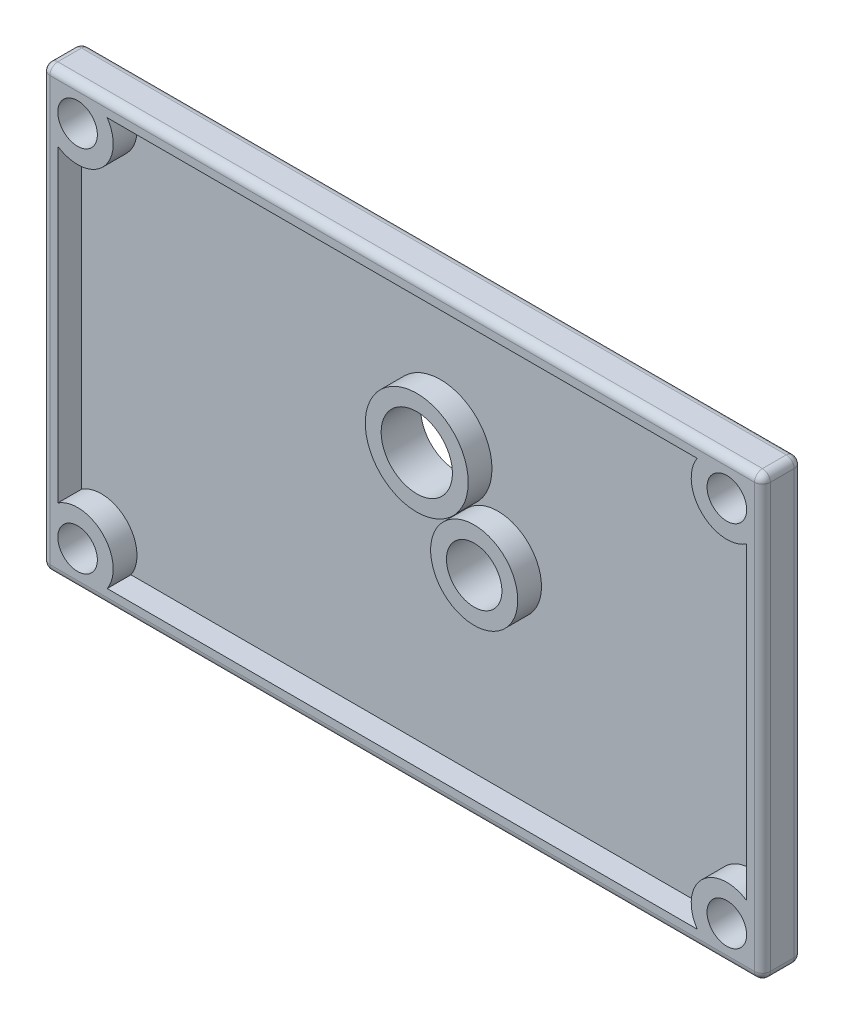
ISO-10303-21;
HEADER;
FILE_DESCRIPTION(('STEP AP214'),'2;1');
FILE_NAME('part.step','',(''),(''),'','','');
FILE_SCHEMA(('AUTOMOTIVE_DESIGN { 1 0 10303 214 1 1 1 1 }'));
ENDSEC;
DATA;
#1=APPLICATION_CONTEXT('core data for automotive mechanical design processes');
#2=APPLICATION_PROTOCOL_DEFINITION('international standard','automotive_design',2000,#1);
#3=PRODUCT_CONTEXT('',#1,'mechanical');
#4=PRODUCT('Part','Part','',(#3));
#5=PRODUCT_RELATED_PRODUCT_CATEGORY('part','',(#4));
#6=PRODUCT_DEFINITION_FORMATION('','',#4);
#7=PRODUCT_DEFINITION_CONTEXT('part definition',#1,'design');
#8=PRODUCT_DEFINITION('design','',#6,#7);
#9=PRODUCT_DEFINITION_SHAPE('','',#8);
#10=(LENGTH_UNIT() NAMED_UNIT(*) SI_UNIT(.MILLI.,.METRE.));
#11=(NAMED_UNIT(*) PLANE_ANGLE_UNIT() SI_UNIT($,.RADIAN.));
#12=(NAMED_UNIT(*) SI_UNIT($,.STERADIAN.) SOLID_ANGLE_UNIT());
#13=UNCERTAINTY_MEASURE_WITH_UNIT(LENGTH_MEASURE(1.E-05),#10,'distance_accuracy_value','');
#14=(GEOMETRIC_REPRESENTATION_CONTEXT(3) GLOBAL_UNCERTAINTY_ASSIGNED_CONTEXT((#13)) GLOBAL_UNIT_ASSIGNED_CONTEXT((#10,
#11,#12)) REPRESENTATION_CONTEXT('',''));
#15=CARTESIAN_POINT('',(0.,0.,0.));
#16=DIRECTION('',(0.,0.,1.));
#17=DIRECTION('',(1.,0.,0.));
#18=AXIS2_PLACEMENT_3D('',#15,#16,#17);
#19=CARTESIAN_POINT('',(0.,0.,5.));
#20=DIRECTION('',(0.,0.,1.));
#21=DIRECTION('',(1.,0.,0.));
#22=AXIS2_PLACEMENT_3D('',#19,#20,#21);
#23=PLANE('',#22);
#24=CARTESIAN_POINT('',(47.3374771884551,-19.0945153491186,5.));
#25=DIRECTION('',(0.,0.,-1.));
#26=DIRECTION('',(-1.,0.,0.));
#27=AXIS2_PLACEMENT_3D('',#24,#25,#26);
#28=CIRCLE('',#27,4.5);
#29=CARTESIAN_POINT('',(42.8374771884551,-19.0945153491186,5.));
#30=VERTEX_POINT('',#29);
#31=EDGE_CURVE('E274',#30,#30,#28,.T.);
#32=ORIENTED_EDGE('',*,*,#31,.T.);
#33=EDGE_LOOP('',(#32));
#34=FACE_BOUND('',#33,.T.);
#35=CARTESIAN_POINT('',(47.3374771884551,-19.0945153491186,5.));
#36=DIRECTION('',(0.,0.,1.));
#37=DIRECTION('',(1.,0.,0.));
#38=AXIS2_PLACEMENT_3D('',#35,#36,#37);
#39=CIRCLE('',#38,6.5);
#40=CARTESIAN_POINT('',(53.8374771884551,-19.0945153491186,5.));
#41=VERTEX_POINT('',#40);
#42=EDGE_CURVE('E217',#41,#41,#39,.F.);
#43=ORIENTED_EDGE('',*,*,#42,.F.);
#44=EDGE_LOOP('',(#43));
#45=FACE_BOUND('',#44,.T.);
#46=ADVANCED_FACE('F36',(#34,#45),#23,.T.);
#47=CARTESIAN_POINT('',(54.5906766165683,-28.8621572456443,5.));
#48=DIRECTION('',(0.,0.,-1.));
#49=DIRECTION('',(-1.,0.,0.));
#50=AXIS2_PLACEMENT_3D('',#47,#48,#49);
#51=CIRCLE('',#50,3.5);
#52=CARTESIAN_POINT('',(51.0906766165683,-28.8621572456443,5.));
#53=VERTEX_POINT('',#52);
#54=EDGE_CURVE('E260',#53,#53,#51,.T.);
#55=ORIENTED_EDGE('',*,*,#54,.T.);
#56=EDGE_LOOP('',(#55));
#57=FACE_BOUND('',#56,.T.);
#58=CARTESIAN_POINT('',(54.5906766165683,-28.8621572456443,5.));
#59=DIRECTION('',(0.,0.,1.));
#60=DIRECTION('',(1.,0.,0.));
#61=AXIS2_PLACEMENT_3D('',#58,#59,#60);
#62=CIRCLE('',#61,5.5);
#63=CARTESIAN_POINT('',(60.0906766165683,-28.8621572456443,5.));
#64=VERTEX_POINT('',#63);
#65=EDGE_CURVE('E222',#64,#64,#62,.F.);
#66=ORIENTED_EDGE('',*,*,#65,.F.);
#67=EDGE_LOOP('',(#66));
#68=FACE_BOUND('',#67,.T.);
#69=ADVANCED_FACE('F501',(#57,#68),#23,.T.);
#70=CARTESIAN_POINT('',(0.,0.,5.));
#71=DIRECTION('',(1.,0.,0.));
#72=DIRECTION('',(0.,1.,0.));
#73=AXIS2_PLACEMENT_3D('',#70,#71,#72);
#74=PLANE('',#73);
#75=DIRECTION('',(0.,-1.,0.));
#76=VECTOR('',#75,1.);
#77=CARTESIAN_POINT('',(0.,0.,4.));
#78=LINE('',#77,#76);
#79=CARTESIAN_POINT('',(0.,-54.5,4.));
#80=VERTEX_POINT('',#79);
#81=CARTESIAN_POINT('',(0.,-1.,4.));
#82=VERTEX_POINT('',#81);
#83=EDGE_CURVE('E301',#80,#82,#78,.F.);
#84=ORIENTED_EDGE('',*,*,#83,.T.);
#85=DIRECTION('',(0.,0.,-1.));
#86=VECTOR('',#85,1.);
#87=CARTESIAN_POINT('',(0.,-1.,0.));
#88=LINE('',#87,#86);
#89=CARTESIAN_POINT('',(0.,-1.,1.));
#90=VERTEX_POINT('',#89);
#91=EDGE_CURVE('E304',#82,#90,#88,.T.);
#92=ORIENTED_EDGE('',*,*,#91,.T.);
#93=DIRECTION('',(0.,-1.,0.));
#94=VECTOR('',#93,1.);
#95=CARTESIAN_POINT('',(0.,0.,1.));
#96=LINE('',#95,#94);
#97=CARTESIAN_POINT('',(0.,-54.5,1.));
#98=VERTEX_POINT('',#97);
#99=EDGE_CURVE('E298',#90,#98,#96,.T.);
#100=ORIENTED_EDGE('',*,*,#99,.T.);
#101=DIRECTION('',(0.,0.,-1.));
#102=VECTOR('',#101,1.);
#103=CARTESIAN_POINT('',(0.,-54.5,5.));
#104=LINE('',#103,#102);
#105=EDGE_CURVE('E296',#98,#80,#104,.F.);
#106=ORIENTED_EDGE('',*,*,#105,.T.);
#107=EDGE_LOOP('',(#84,#92,#100,#106));
#108=FACE_BOUND('',#107,.T.);
#109=ADVANCED_FACE('F499',(#108),#74,.F.);
#110=CARTESIAN_POINT('',(0.,-55.5,5.));
#111=DIRECTION('',(0.,1.,0.));
#112=DIRECTION('',(0.,0.,1.));
#113=AXIS2_PLACEMENT_3D('',#110,#111,#112);
#114=PLANE('',#113);
#115=DIRECTION('',(1.,0.,0.));
#116=VECTOR('',#115,1.);
#117=CARTESIAN_POINT('',(0.,-55.5,4.));
#118=LINE('',#117,#116);
#119=CARTESIAN_POINT('',(90.,-55.5,4.));
#120=VERTEX_POINT('',#119);
#121=CARTESIAN_POINT('',(1.00000000000001,-55.5,4.));
#122=VERTEX_POINT('',#121);
#123=EDGE_CURVE('E325',#120,#122,#118,.F.);
#124=ORIENTED_EDGE('',*,*,#123,.T.);
#125=DIRECTION('',(0.,0.,-1.));
#126=VECTOR('',#125,1.);
#127=CARTESIAN_POINT('',(1.00000000000001,-55.5,5.));
#128=LINE('',#127,#126);
#129=CARTESIAN_POINT('',(1.00000000000001,-55.5,1.));
#130=VERTEX_POINT('',#129);
#131=EDGE_CURVE('E327',#122,#130,#128,.T.);
#132=ORIENTED_EDGE('',*,*,#131,.T.);
#133=DIRECTION('',(1.,0.,0.));
#134=VECTOR('',#133,1.);
#135=CARTESIAN_POINT('',(0.,-55.5,1.));
#136=LINE('',#135,#134);
#137=CARTESIAN_POINT('',(90.,-55.5,1.));
#138=VERTEX_POINT('',#137);
#139=EDGE_CURVE('E319',#130,#138,#136,.T.);
#140=ORIENTED_EDGE('',*,*,#139,.T.);
#141=DIRECTION('',(0.,0.,-1.));
#142=VECTOR('',#141,1.);
#143=CARTESIAN_POINT('',(90.,-55.5,5.));
#144=LINE('',#143,#142);
#145=EDGE_CURVE('E322',#138,#120,#144,.F.);
#146=ORIENTED_EDGE('',*,*,#145,.T.);
#147=EDGE_LOOP('',(#124,#132,#140,#146));
#148=FACE_BOUND('',#147,.T.);
#149=ADVANCED_FACE('F426',(#148),#114,.F.);
#150=CARTESIAN_POINT('',(91.,0.,5.));
#151=DIRECTION('',(1.,0.,0.));
#152=DIRECTION('',(0.,1.,0.));
#153=AXIS2_PLACEMENT_3D('',#150,#151,#152);
#154=PLANE('',#153);
#155=DIRECTION('',(0.,0.,-1.));
#156=VECTOR('',#155,1.);
#157=CARTESIAN_POINT('',(91.,-54.5,0.));
#158=LINE('',#157,#156);
#159=CARTESIAN_POINT('',(91.,-54.5,4.));
#160=VERTEX_POINT('',#159);
#161=CARTESIAN_POINT('',(91.,-54.5,1.));
#162=VERTEX_POINT('',#161);
#163=EDGE_CURVE('E330',#160,#162,#158,.T.);
#164=ORIENTED_EDGE('',*,*,#163,.T.);
#165=DIRECTION('',(0.,-1.,0.));
#166=VECTOR('',#165,1.);
#167=CARTESIAN_POINT('',(91.,0.,1.));
#168=LINE('',#167,#166);
#169=CARTESIAN_POINT('',(91.,-1.,1.));
#170=VERTEX_POINT('',#169);
#171=EDGE_CURVE('E374',#162,#170,#168,.F.);
#172=ORIENTED_EDGE('',*,*,#171,.T.);
#173=DIRECTION('',(0.,0.,-1.));
#174=VECTOR('',#173,1.);
#175=CARTESIAN_POINT('',(91.,-1.,5.));
#176=LINE('',#175,#174);
#177=CARTESIAN_POINT('',(91.,-1.,4.));
#178=VERTEX_POINT('',#177);
#179=EDGE_CURVE('E370',#170,#178,#176,.F.);
#180=ORIENTED_EDGE('',*,*,#179,.T.);
#181=DIRECTION('',(0.,-1.,0.));
#182=VECTOR('',#181,1.);
#183=CARTESIAN_POINT('',(91.,0.,4.));
#184=LINE('',#183,#182);
#185=EDGE_CURVE('E372',#178,#160,#184,.T.);
#186=ORIENTED_EDGE('',*,*,#185,.T.);
#187=EDGE_LOOP('',(#164,#172,#180,#186));
#188=FACE_BOUND('',#187,.T.);
#189=ADVANCED_FACE('F454',(#188),#154,.T.);
#190=CARTESIAN_POINT('',(0.,0.,5.));
#191=DIRECTION('',(0.,1.,0.));
#192=DIRECTION('',(0.,0.,1.));
#193=AXIS2_PLACEMENT_3D('',#190,#191,#192);
#194=PLANE('',#193);
#195=DIRECTION('',(0.,0.,-1.));
#196=VECTOR('',#195,1.);
#197=CARTESIAN_POINT('',(1.,0.,5.));
#198=LINE('',#197,#196);
#199=CARTESIAN_POINT('',(1.,0.,1.));
#200=VERTEX_POINT('',#199);
#201=CARTESIAN_POINT('',(1.,0.,4.));
#202=VERTEX_POINT('',#201);
#203=EDGE_CURVE('E307',#200,#202,#198,.F.);
#204=ORIENTED_EDGE('',*,*,#203,.T.);
#205=DIRECTION('',(1.,0.,0.));
#206=VECTOR('',#205,1.);
#207=CARTESIAN_POINT('',(0.,0.,4.));
#208=LINE('',#207,#206);
#209=CARTESIAN_POINT('',(90.,0.,4.));
#210=VERTEX_POINT('',#209);
#211=EDGE_CURVE('E11',#202,#210,#208,.T.);
#212=ORIENTED_EDGE('',*,*,#211,.T.);
#213=DIRECTION('',(0.,0.,-1.));
#214=VECTOR('',#213,1.);
#215=CARTESIAN_POINT('',(90.,0.,5.));
#216=LINE('',#215,#214);
#217=CARTESIAN_POINT('',(90.,0.,1.));
#218=VERTEX_POINT('',#217);
#219=EDGE_CURVE('E45',#210,#218,#216,.T.);
#220=ORIENTED_EDGE('',*,*,#219,.T.);
#221=DIRECTION('',(1.,0.,0.));
#222=VECTOR('',#221,1.);
#223=CARTESIAN_POINT('',(1.,0.,1.));
#224=LINE('',#223,#222);
#225=EDGE_CURVE('E380',#218,#200,#224,.F.);
#226=ORIENTED_EDGE('',*,*,#225,.T.);
#227=EDGE_LOOP('',(#204,#212,#220,#226));
#228=FACE_BOUND('',#227,.T.);
#229=ADVANCED_FACE('F485',(#228),#194,.T.);
#230=CARTESIAN_POINT('',(4.50000000000001,-51.,5.));
#231=DIRECTION('',(0.,0.,1.));
#232=DIRECTION('',(1.,0.,0.));
#233=AXIS2_PLACEMENT_3D('',#230,#231,#232);
#234=CIRCLE('',#233,4.5);
#235=CARTESIAN_POINT('',(2.00000000000001,-47.2583426132261,5.));
#236=VERTEX_POINT('',#235);
#237=CARTESIAN_POINT('',(8.24165738677396,-53.5,5.));
#238=VERTEX_POINT('',#237);
#239=EDGE_CURVE('E231',#236,#238,#234,.F.);
#240=ORIENTED_EDGE('',*,*,#239,.F.);
#241=DIRECTION('',(0.,1.,0.));
#242=VECTOR('',#241,1.);
#243=CARTESIAN_POINT('',(2.,0.,5.));
#244=LINE('',#243,#242);
#245=CARTESIAN_POINT('',(2.,-8.24165738677392,5.));
#246=VERTEX_POINT('',#245);
#247=EDGE_CURVE('E207',#236,#246,#244,.T.);
#248=ORIENTED_EDGE('',*,*,#247,.T.);
#249=CARTESIAN_POINT('',(4.50000000000001,-4.5,5.));
#250=DIRECTION('',(0.,0.,1.));
#251=DIRECTION('',(1.,0.,0.));
#252=AXIS2_PLACEMENT_3D('',#249,#250,#251);
#253=CIRCLE('',#252,4.5);
#254=CARTESIAN_POINT('',(8.24165738677395,-2.,5.));
#255=VERTEX_POINT('',#254);
#256=EDGE_CURVE('E218',#255,#246,#253,.F.);
#257=ORIENTED_EDGE('',*,*,#256,.F.);
#258=DIRECTION('',(-1.,0.,0.));
#259=VECTOR('',#258,1.);
#260=CARTESIAN_POINT('',(0.,-2.,5.));
#261=LINE('',#260,#259);
#262=CARTESIAN_POINT('',(82.758342613226,-2.,5.));
#263=VERTEX_POINT('',#262);
#264=EDGE_CURVE('E53',#263,#255,#261,.T.);
#265=ORIENTED_EDGE('',*,*,#264,.F.);
#266=CARTESIAN_POINT('',(86.5,-4.5,5.));
#267=DIRECTION('',(0.,0.,1.));
#268=DIRECTION('',(1.,0.,0.));
#269=AXIS2_PLACEMENT_3D('',#266,#267,#268);
#270=CIRCLE('',#269,4.5);
#271=CARTESIAN_POINT('',(89.,-8.24165738677393,5.));
#272=VERTEX_POINT('',#271);
#273=EDGE_CURVE('E226',#272,#263,#270,.F.);
#274=ORIENTED_EDGE('',*,*,#273,.F.);
#275=DIRECTION('',(0.,-1.,0.));
#276=VECTOR('',#275,1.);
#277=CARTESIAN_POINT('',(89.,0.,5.));
#278=LINE('',#277,#276);
#279=CARTESIAN_POINT('',(89.,-47.2583426132261,5.));
#280=VERTEX_POINT('',#279);
#281=EDGE_CURVE('E200',#272,#280,#278,.T.);
#282=ORIENTED_EDGE('',*,*,#281,.T.);
#283=CARTESIAN_POINT('',(86.5,-51.,5.));
#284=DIRECTION('',(0.,0.,1.));
#285=DIRECTION('',(1.,0.,0.));
#286=AXIS2_PLACEMENT_3D('',#283,#284,#285);
#287=CIRCLE('',#286,4.5);
#288=CARTESIAN_POINT('',(82.758342613226,-53.5,5.));
#289=VERTEX_POINT('',#288);
#290=EDGE_CURVE('E193',#289,#280,#287,.F.);
#291=ORIENTED_EDGE('',*,*,#290,.F.);
#292=DIRECTION('',(1.,0.,0.));
#293=VECTOR('',#292,1.);
#294=CARTESIAN_POINT('',(0.,-53.5,5.));
#295=LINE('',#294,#293);
#296=EDGE_CURVE('E180',#238,#289,#295,.T.);
#297=ORIENTED_EDGE('',*,*,#296,.F.);
#298=EDGE_LOOP('',(#240,#248,#257,#265,#274,#282,#291,#297));
#299=FACE_BOUND('',#298,.T.);
#300=CARTESIAN_POINT('',(86.5,-51.,5.));
#301=DIRECTION('',(0.,0.,-1.));
#302=DIRECTION('',(-1.,0.,0.));
#303=AXIS2_PLACEMENT_3D('',#300,#301,#302);
#304=CIRCLE('',#303,2.5);
#305=CARTESIAN_POINT('',(84.,-51.,5.));
#306=VERTEX_POINT('',#305);
#307=EDGE_CURVE('E273',#306,#306,#304,.T.);
#308=ORIENTED_EDGE('',*,*,#307,.T.);
#309=EDGE_LOOP('',(#308));
#310=FACE_BOUND('',#309,.T.);
#311=CARTESIAN_POINT('',(4.50000000000001,-4.5,5.));
#312=DIRECTION('',(0.,0.,-1.));
#313=DIRECTION('',(-1.,0.,0.));
#314=AXIS2_PLACEMENT_3D('',#311,#312,#313);
#315=CIRCLE('',#314,2.5);
#316=CARTESIAN_POINT('',(2.00000000000002,-4.5,5.));
#317=VERTEX_POINT('',#316);
#318=EDGE_CURVE('E281',#317,#317,#315,.T.);
#319=ORIENTED_EDGE('',*,*,#318,.T.);
#320=EDGE_LOOP('',(#319));
#321=FACE_BOUND('',#320,.T.);
#322=CARTESIAN_POINT('',(86.5,-4.5,5.));
#323=DIRECTION('',(0.,0.,-1.));
#324=DIRECTION('',(-1.,0.,0.));
#325=AXIS2_PLACEMENT_3D('',#322,#323,#324);
#326=CIRCLE('',#325,2.5);
#327=CARTESIAN_POINT('',(84.,-4.5,5.));
#328=VERTEX_POINT('',#327);
#329=EDGE_CURVE('E267',#328,#328,#326,.T.);
#330=ORIENTED_EDGE('',*,*,#329,.T.);
#331=EDGE_LOOP('',(#330));
#332=FACE_BOUND('',#331,.T.);
#333=CARTESIAN_POINT('',(4.50000000000001,-51.,5.));
#334=DIRECTION('',(0.,0.,-1.));
#335=DIRECTION('',(-1.,0.,0.));
#336=AXIS2_PLACEMENT_3D('',#333,#334,#335);
#337=CIRCLE('',#336,2.5);
#338=CARTESIAN_POINT('',(2.00000000000001,-51.,5.));
#339=VERTEX_POINT('',#338);
#340=EDGE_CURVE('E290',#339,#339,#337,.T.);
#341=ORIENTED_EDGE('',*,*,#340,.T.);
#342=EDGE_LOOP('',(#341));
#343=FACE_BOUND('',#342,.T.);
#344=DIRECTION('',(1.,0.,0.));
#345=VECTOR('',#344,1.);
#346=CARTESIAN_POINT('',(91.,-54.5,5.));
#347=LINE('',#346,#345);
#348=CARTESIAN_POINT('',(1.00000000000002,-54.5,5.));
#349=VERTEX_POINT('',#348);
#350=CARTESIAN_POINT('',(90.,-54.5,5.));
#351=VERTEX_POINT('',#350);
#352=EDGE_CURVE('E309',#349,#351,#347,.T.);
#353=ORIENTED_EDGE('',*,*,#352,.T.);
#354=DIRECTION('',(0.,-1.,0.));
#355=VECTOR('',#354,1.);
#356=CARTESIAN_POINT('',(90.,0.,5.));
#357=LINE('',#356,#355);
#358=CARTESIAN_POINT('',(90.,-1.,5.));
#359=VERTEX_POINT('',#358);
#360=EDGE_CURVE('E378',#351,#359,#357,.F.);
#361=ORIENTED_EDGE('',*,*,#360,.T.);
#362=DIRECTION('',(1.,0.,0.));
#363=VECTOR('',#362,1.);
#364=CARTESIAN_POINT('',(0.,-1.,5.));
#365=LINE('',#364,#363);
#366=CARTESIAN_POINT('',(1.,-1.,5.));
#367=VERTEX_POINT('',#366);
#368=EDGE_CURVE('E376',#359,#367,#365,.F.);
#369=ORIENTED_EDGE('',*,*,#368,.T.);
#370=DIRECTION('',(0.,-1.,0.));
#371=VECTOR('',#370,1.);
#372=CARTESIAN_POINT('',(1.00000000000002,-55.5,5.));
#373=LINE('',#372,#371);
#374=EDGE_CURVE('E312',#367,#349,#373,.T.);
#375=ORIENTED_EDGE('',*,*,#374,.T.);
#376=EDGE_LOOP('',(#353,#361,#369,#375));
#377=FACE_BOUND('',#376,.T.);
#378=ADVANCED_FACE('F473',(#299,#310,#321,#332,#343,#377),#23,.T.);
#379=CARTESIAN_POINT('',(0.,0.,0.));
#380=DIRECTION('',(0.,0.,1.));
#381=DIRECTION('',(1.,0.,0.));
#382=AXIS2_PLACEMENT_3D('',#379,#380,#381);
#383=PLANE('',#382);
#384=CARTESIAN_POINT('',(86.5,-51.,0.));
#385=DIRECTION('',(0.,0.,-1.));
#386=DIRECTION('',(-1.,0.,0.));
#387=AXIS2_PLACEMENT_3D('',#384,#385,#386);
#388=CIRCLE('',#387,2.5);
#389=CARTESIAN_POINT('',(84.,-51.,0.));
#390=VERTEX_POINT('',#389);
#391=EDGE_CURVE('E259',#390,#390,#388,.T.);
#392=ORIENTED_EDGE('',*,*,#391,.F.);
#393=EDGE_LOOP('',(#392));
#394=FACE_BOUND('',#393,.T.);
#395=CARTESIAN_POINT('',(47.3374771884551,-19.0945153491186,0.));
#396=DIRECTION('',(0.,0.,-1.));
#397=DIRECTION('',(-1.,0.,0.));
#398=AXIS2_PLACEMENT_3D('',#395,#396,#397);
#399=CIRCLE('',#398,4.5);
#400=CARTESIAN_POINT('',(42.8374771884551,-19.0945153491186,0.));
#401=VERTEX_POINT('',#400);
#402=EDGE_CURVE('E278',#401,#401,#399,.T.);
#403=ORIENTED_EDGE('',*,*,#402,.F.);
#404=EDGE_LOOP('',(#403));
#405=FACE_BOUND('',#404,.T.);
#406=CARTESIAN_POINT('',(4.50000000000001,-4.5,0.));
#407=DIRECTION('',(0.,0.,-1.));
#408=DIRECTION('',(-1.,0.,0.));
#409=AXIS2_PLACEMENT_3D('',#406,#407,#408);
#410=CIRCLE('',#409,2.5);
#411=CARTESIAN_POINT('',(2.00000000000002,-4.5,0.));
#412=VERTEX_POINT('',#411);
#413=EDGE_CURVE('E263',#412,#412,#410,.T.);
#414=ORIENTED_EDGE('',*,*,#413,.F.);
#415=EDGE_LOOP('',(#414));
#416=FACE_BOUND('',#415,.T.);
#417=CARTESIAN_POINT('',(54.5906766165683,-28.8621572456443,0.));
#418=DIRECTION('',(0.,0.,-1.));
#419=DIRECTION('',(-1.,0.,0.));
#420=AXIS2_PLACEMENT_3D('',#417,#418,#419);
#421=CIRCLE('',#420,3.5);
#422=CARTESIAN_POINT('',(51.0906766165683,-28.8621572456443,0.));
#423=VERTEX_POINT('',#422);
#424=EDGE_CURVE('E264',#423,#423,#421,.T.);
#425=ORIENTED_EDGE('',*,*,#424,.F.);
#426=EDGE_LOOP('',(#425));
#427=FACE_BOUND('',#426,.T.);
#428=CARTESIAN_POINT('',(86.5,-4.5,0.));
#429=DIRECTION('',(0.,0.,-1.));
#430=DIRECTION('',(-1.,0.,0.));
#431=AXIS2_PLACEMENT_3D('',#428,#429,#430);
#432=CIRCLE('',#431,2.5);
#433=CARTESIAN_POINT('',(84.,-4.5,0.));
#434=VERTEX_POINT('',#433);
#435=EDGE_CURVE('E270',#434,#434,#432,.T.);
#436=ORIENTED_EDGE('',*,*,#435,.F.);
#437=EDGE_LOOP('',(#436));
#438=FACE_BOUND('',#437,.T.);
#439=CARTESIAN_POINT('',(4.50000000000001,-51.,0.));
#440=DIRECTION('',(0.,0.,-1.));
#441=DIRECTION('',(-1.,0.,0.));
#442=AXIS2_PLACEMENT_3D('',#439,#440,#441);
#443=CIRCLE('',#442,2.5);
#444=CARTESIAN_POINT('',(2.00000000000001,-51.,0.));
#445=VERTEX_POINT('',#444);
#446=EDGE_CURVE('E277',#445,#445,#443,.T.);
#447=ORIENTED_EDGE('',*,*,#446,.F.);
#448=EDGE_LOOP('',(#447));
#449=FACE_BOUND('',#448,.T.);
#450=DIRECTION('',(1.,0.,0.));
#451=VECTOR('',#450,1.);
#452=CARTESIAN_POINT('',(91.,-1.,0.));
#453=LINE('',#452,#451);
#454=CARTESIAN_POINT('',(1.,-1.,0.));
#455=VERTEX_POINT('',#454);
#456=CARTESIAN_POINT('',(90.,-1.,0.));
#457=VERTEX_POINT('',#456);
#458=EDGE_CURVE('E366',#455,#457,#453,.T.);
#459=ORIENTED_EDGE('',*,*,#458,.T.);
#460=DIRECTION('',(0.,-1.,0.));
#461=VECTOR('',#460,1.);
#462=CARTESIAN_POINT('',(90.,-54.5,0.));
#463=LINE('',#462,#461);
#464=CARTESIAN_POINT('',(90.,-54.5,0.));
#465=VERTEX_POINT('',#464);
#466=EDGE_CURVE('E368',#457,#465,#463,.T.);
#467=ORIENTED_EDGE('',*,*,#466,.T.);
#468=DIRECTION('',(1.,0.,0.));
#469=VECTOR('',#468,1.);
#470=CARTESIAN_POINT('',(0.,-54.5,0.));
#471=LINE('',#470,#469);
#472=CARTESIAN_POINT('',(1.00000000000001,-54.5,0.));
#473=VERTEX_POINT('',#472);
#474=EDGE_CURVE('E314',#465,#473,#471,.F.);
#475=ORIENTED_EDGE('',*,*,#474,.T.);
#476=DIRECTION('',(0.,-1.,0.));
#477=VECTOR('',#476,1.);
#478=CARTESIAN_POINT('',(1.,0.,0.));
#479=LINE('',#478,#477);
#480=EDGE_CURVE('E316',#473,#455,#479,.F.);
#481=ORIENTED_EDGE('',*,*,#480,.T.);
#482=EDGE_LOOP('',(#459,#467,#475,#481));
#483=FACE_BOUND('',#482,.T.);
#484=ADVANCED_FACE('F519',(#394,#405,#416,#427,#438,#449,#483),#383,.F.);
#485=CARTESIAN_POINT('',(90.,-54.5,5.));
#486=DIRECTION('',(0.,0.,1.));
#487=DIRECTION('',(1.,0.,0.));
#488=AXIS2_PLACEMENT_3D('',#485,#486,#487);
#489=CYLINDRICAL_SURFACE('',#488,1.);
#490=ORIENTED_EDGE('',*,*,#145,.F.);
#491=CARTESIAN_POINT('',(90.,-54.5,1.));
#492=DIRECTION('',(0.,0.,1.));
#493=DIRECTION('',(1.,0.,0.));
#494=AXIS2_PLACEMENT_3D('',#491,#492,#493);
#495=CIRCLE('',#494,1.);
#496=EDGE_CURVE('E354',#138,#162,#495,.T.);
#497=ORIENTED_EDGE('',*,*,#496,.T.);
#498=ORIENTED_EDGE('',*,*,#163,.F.);
#499=CARTESIAN_POINT('',(90.,-54.5,4.));
#500=DIRECTION('',(0.,0.,1.));
#501=DIRECTION('',(1.,0.,0.));
#502=AXIS2_PLACEMENT_3D('',#499,#500,#501);
#503=CIRCLE('',#502,1.);
#504=EDGE_CURVE('E352',#160,#120,#503,.F.);
#505=ORIENTED_EDGE('',*,*,#504,.T.);
#506=EDGE_LOOP('',(#490,#497,#498,#505));
#507=FACE_BOUND('',#506,.T.);
#508=ADVANCED_FACE('F423',(#507),#489,.T.);
#509=CARTESIAN_POINT('',(0.,-54.5,4.));
#510=DIRECTION('',(-1.,0.,0.));
#511=DIRECTION('',(0.,0.,1.));
#512=AXIS2_PLACEMENT_3D('',#509,#510,#511);
#513=CYLINDRICAL_SURFACE('',#512,1.);
#514=ORIENTED_EDGE('',*,*,#123,.F.);
#515=CARTESIAN_POINT('',(90.,-54.5,4.));
#516=DIRECTION('',(-1.,0.,0.));
#517=DIRECTION('',(0.,0.,1.));
#518=AXIS2_PLACEMENT_3D('',#515,#516,#517);
#519=CIRCLE('',#518,1.);
#520=EDGE_CURVE('E356',#120,#351,#519,.T.);
#521=ORIENTED_EDGE('',*,*,#520,.T.);
#522=ORIENTED_EDGE('',*,*,#352,.F.);
#523=CARTESIAN_POINT('',(1.00000000000001,-54.5,4.));
#524=DIRECTION('',(-1.,0.,0.));
#525=DIRECTION('',(0.,0.,1.));
#526=AXIS2_PLACEMENT_3D('',#523,#524,#525);
#527=CIRCLE('',#526,1.);
#528=EDGE_CURVE('E299',#122,#349,#527,.T.);
#529=ORIENTED_EDGE('',*,*,#528,.F.);
#530=EDGE_LOOP('',(#514,#521,#522,#529));
#531=FACE_BOUND('',#530,.T.);
#532=ADVANCED_FACE('F431',(#531),#513,.T.);
#533=CARTESIAN_POINT('',(1.00000000000001,-54.5,5.));
#534=DIRECTION('',(0.,0.,-1.));
#535=DIRECTION('',(-1.,0.,0.));
#536=AXIS2_PLACEMENT_3D('',#533,#534,#535);
#537=CYLINDRICAL_SURFACE('',#536,1.);
#538=CARTESIAN_POINT('',(1.00000000000001,-54.5,1.));
#539=DIRECTION('',(0.,0.,-1.));
#540=DIRECTION('',(-1.,0.,0.));
#541=AXIS2_PLACEMENT_3D('',#538,#539,#540);
#542=CIRCLE('',#541,1.);
#543=EDGE_CURVE('E342',#130,#98,#542,.T.);
#544=ORIENTED_EDGE('',*,*,#543,.F.);
#545=ORIENTED_EDGE('',*,*,#131,.F.);
#546=CARTESIAN_POINT('',(1.00000000000001,-54.5,4.));
#547=DIRECTION('',(0.,0.,1.));
#548=DIRECTION('',(1.,0.,0.));
#549=AXIS2_PLACEMENT_3D('',#546,#547,#548);
#550=CIRCLE('',#549,1.);
#551=EDGE_CURVE('E345',#80,#122,#550,.T.);
#552=ORIENTED_EDGE('',*,*,#551,.F.);
#553=ORIENTED_EDGE('',*,*,#105,.F.);
#554=EDGE_LOOP('',(#544,#545,#552,#553));
#555=FACE_BOUND('',#554,.T.);
#556=ADVANCED_FACE('F441',(#555),#537,.T.);
#557=CARTESIAN_POINT('',(0.,-54.5,1.));
#558=DIRECTION('',(1.,0.,0.));
#559=DIRECTION('',(0.,0.,-1.));
#560=AXIS2_PLACEMENT_3D('',#557,#558,#559);
#561=CYLINDRICAL_SURFACE('',#560,1.);
#562=ORIENTED_EDGE('',*,*,#474,.F.);
#563=CARTESIAN_POINT('',(90.,-54.5,1.));
#564=DIRECTION('',(1.,0.,0.));
#565=DIRECTION('',(0.,0.,-1.));
#566=AXIS2_PLACEMENT_3D('',#563,#564,#565);
#567=CIRCLE('',#566,1.);
#568=EDGE_CURVE('E333',#465,#138,#567,.F.);
#569=ORIENTED_EDGE('',*,*,#568,.T.);
#570=ORIENTED_EDGE('',*,*,#139,.F.);
#571=CARTESIAN_POINT('',(1.00000000000001,-54.5,1.));
#572=DIRECTION('',(-1.,0.,0.));
#573=DIRECTION('',(0.,0.,1.));
#574=AXIS2_PLACEMENT_3D('',#571,#572,#573);
#575=CIRCLE('',#574,1.);
#576=EDGE_CURVE('E340',#473,#130,#575,.T.);
#577=ORIENTED_EDGE('',*,*,#576,.F.);
#578=EDGE_LOOP('',(#562,#569,#570,#577));
#579=FACE_BOUND('',#578,.T.);
#580=ADVANCED_FACE('F447',(#579),#561,.T.);
#581=CARTESIAN_POINT('',(1.00000000000001,-54.5,4.));
#582=DIRECTION('',(0.,0.,1.));
#583=DIRECTION('',(1.,0.,0.));
#584=AXIS2_PLACEMENT_3D('',#581,#582,#583);
#585=SPHERICAL_SURFACE('',#584,1.);
#586=ORIENTED_EDGE('',*,*,#551,.T.);
#587=ORIENTED_EDGE('',*,*,#528,.T.);
#588=CARTESIAN_POINT('',(1.00000000000002,-54.5,4.));
#589=DIRECTION('',(0.,-1.,0.));
#590=DIRECTION('',(0.,0.,-1.));
#591=AXIS2_PLACEMENT_3D('',#588,#589,#590);
#592=CIRCLE('',#591,1.);
#593=EDGE_CURVE('E337',#80,#349,#592,.F.);
#594=ORIENTED_EDGE('',*,*,#593,.F.);
#595=EDGE_LOOP('',(#586,#587,#594));
#596=FACE_BOUND('',#595,.T.);
#597=ADVANCED_FACE('F436',(#596),#585,.T.);
#598=CARTESIAN_POINT('',(1.00000000000001,-54.5,1.));
#599=DIRECTION('',(0.,0.,1.));
#600=DIRECTION('',(1.,0.,0.));
#601=AXIS2_PLACEMENT_3D('',#598,#599,#600);
#602=SPHERICAL_SURFACE('',#601,1.);
#603=ORIENTED_EDGE('',*,*,#576,.T.);
#604=ORIENTED_EDGE('',*,*,#543,.T.);
#605=CARTESIAN_POINT('',(1.00000000000001,-54.5,1.));
#606=DIRECTION('',(0.,-1.,0.));
#607=DIRECTION('',(0.,0.,-1.));
#608=AXIS2_PLACEMENT_3D('',#605,#606,#607);
#609=CIRCLE('',#608,1.);
#610=EDGE_CURVE('E334',#473,#98,#609,.F.);
#611=ORIENTED_EDGE('',*,*,#610,.F.);
#612=EDGE_LOOP('',(#603,#604,#611));
#613=FACE_BOUND('',#612,.T.);
#614=ADVANCED_FACE('F818',(#613),#602,.T.);
#615=CARTESIAN_POINT('',(1.,0.,4.));
#616=DIRECTION('',(0.,1.,0.));
#617=DIRECTION('',(-1.,0.,0.));
#618=AXIS2_PLACEMENT_3D('',#615,#616,#617);
#619=CYLINDRICAL_SURFACE('',#618,1.);
#620=ORIENTED_EDGE('',*,*,#374,.F.);
#621=CARTESIAN_POINT('',(1.,-1.,4.));
#622=DIRECTION('',(0.,1.,0.));
#623=DIRECTION('',(-1.,0.,0.));
#624=AXIS2_PLACEMENT_3D('',#621,#622,#623);
#625=CIRCLE('',#624,1.);
#626=EDGE_CURVE('E362',#367,#82,#625,.F.);
#627=ORIENTED_EDGE('',*,*,#626,.T.);
#628=ORIENTED_EDGE('',*,*,#83,.F.);
#629=ORIENTED_EDGE('',*,*,#593,.T.);
#630=EDGE_LOOP('',(#620,#627,#628,#629));
#631=FACE_BOUND('',#630,.T.);
#632=ADVANCED_FACE('F476',(#631),#619,.T.);
#633=CARTESIAN_POINT('',(1.,0.,1.));
#634=DIRECTION('',(0.,-1.,0.));
#635=DIRECTION('',(1.,0.,0.));
#636=AXIS2_PLACEMENT_3D('',#633,#634,#635);
#637=CYLINDRICAL_SURFACE('',#636,1.);
#638=ORIENTED_EDGE('',*,*,#99,.F.);
#639=CARTESIAN_POINT('',(1.,-1.,1.));
#640=DIRECTION('',(0.,-1.,0.));
#641=DIRECTION('',(1.,0.,0.));
#642=AXIS2_PLACEMENT_3D('',#639,#640,#641);
#643=CIRCLE('',#642,1.);
#644=EDGE_CURVE('E364',#90,#455,#643,.T.);
#645=ORIENTED_EDGE('',*,*,#644,.T.);
#646=ORIENTED_EDGE('',*,*,#480,.F.);
#647=ORIENTED_EDGE('',*,*,#610,.T.);
#648=EDGE_LOOP('',(#638,#645,#646,#647));
#649=FACE_BOUND('',#648,.T.);
#650=ADVANCED_FACE('F496',(#649),#637,.T.);
#651=CARTESIAN_POINT('',(1.,-1.,5.));
#652=DIRECTION('',(0.,0.,1.));
#653=DIRECTION('',(1.,0.,0.));
#654=AXIS2_PLACEMENT_3D('',#651,#652,#653);
#655=CYLINDRICAL_SURFACE('',#654,1.);
#656=ORIENTED_EDGE('',*,*,#91,.F.);
#657=CARTESIAN_POINT('',(1.,-1.,4.));
#658=DIRECTION('',(0.,0.,1.));
#659=DIRECTION('',(1.,0.,0.));
#660=AXIS2_PLACEMENT_3D('',#657,#658,#659);
#661=CIRCLE('',#660,1.);
#662=EDGE_CURVE('E360',#82,#202,#661,.F.);
#663=ORIENTED_EDGE('',*,*,#662,.T.);
#664=ORIENTED_EDGE('',*,*,#203,.F.);
#665=CARTESIAN_POINT('',(1.,-1.,1.));
#666=DIRECTION('',(0.,0.,1.));
#667=DIRECTION('',(1.,0.,0.));
#668=AXIS2_PLACEMENT_3D('',#665,#666,#667);
#669=CIRCLE('',#668,1.);
#670=EDGE_CURVE('E358',#200,#90,#669,.T.);
#671=ORIENTED_EDGE('',*,*,#670,.T.);
#672=EDGE_LOOP('',(#656,#663,#664,#671));
#673=FACE_BOUND('',#672,.T.);
#674=ADVANCED_FACE('F483',(#673),#655,.T.);
#675=CARTESIAN_POINT('',(90.,-54.5,4.));
#676=DIRECTION('',(0.,0.,1.));
#677=DIRECTION('',(1.,0.,0.));
#678=AXIS2_PLACEMENT_3D('',#675,#676,#677);
#679=SPHERICAL_SURFACE('',#678,1.);
#680=ORIENTED_EDGE('',*,*,#520,.F.);
#681=ORIENTED_EDGE('',*,*,#504,.F.);
#682=CARTESIAN_POINT('',(90.,-54.5,4.));
#683=DIRECTION('',(0.,1.,0.));
#684=DIRECTION('',(0.,0.,1.));
#685=AXIS2_PLACEMENT_3D('',#682,#683,#684);
#686=CIRCLE('',#685,1.);
#687=EDGE_CURVE('E40',#351,#160,#686,.T.);
#688=ORIENTED_EDGE('',*,*,#687,.F.);
#689=EDGE_LOOP('',(#680,#681,#688));
#690=FACE_BOUND('',#689,.T.);
#691=ADVANCED_FACE('F38',(#690),#679,.T.);
#692=CARTESIAN_POINT('',(1.,-1.,4.));
#693=DIRECTION('',(0.,0.,1.));
#694=DIRECTION('',(1.,0.,0.));
#695=AXIS2_PLACEMENT_3D('',#692,#693,#694);
#696=SPHERICAL_SURFACE('',#695,1.);
#697=ORIENTED_EDGE('',*,*,#662,.F.);
#698=ORIENTED_EDGE('',*,*,#626,.F.);
#699=CARTESIAN_POINT('',(1.,-1.,4.));
#700=DIRECTION('',(1.,0.,0.));
#701=DIRECTION('',(0.,0.,-1.));
#702=AXIS2_PLACEMENT_3D('',#699,#700,#701);
#703=CIRCLE('',#702,1.);
#704=EDGE_CURVE('E405',#202,#367,#703,.T.);
#705=ORIENTED_EDGE('',*,*,#704,.F.);
#706=EDGE_LOOP('',(#697,#698,#705));
#707=FACE_BOUND('',#706,.T.);
#708=ADVANCED_FACE('F479',(#707),#696,.T.);
#709=CARTESIAN_POINT('',(90.,0.,4.));
#710=DIRECTION('',(0.,-1.,0.));
#711=DIRECTION('',(1.,0.,0.));
#712=AXIS2_PLACEMENT_3D('',#709,#710,#711);
#713=CYLINDRICAL_SURFACE('',#712,1.);
#714=ORIENTED_EDGE('',*,*,#687,.T.);
#715=ORIENTED_EDGE('',*,*,#185,.F.);
#716=CARTESIAN_POINT('',(90.,-1.,4.));
#717=DIRECTION('',(0.,1.,0.));
#718=DIRECTION('',(-1.,0.,0.));
#719=AXIS2_PLACEMENT_3D('',#716,#717,#718);
#720=CIRCLE('',#719,1.);
#721=EDGE_CURVE('E403',#359,#178,#720,.T.);
#722=ORIENTED_EDGE('',*,*,#721,.F.);
#723=ORIENTED_EDGE('',*,*,#360,.F.);
#724=EDGE_LOOP('',(#714,#715,#722,#723));
#725=FACE_BOUND('',#724,.T.);
#726=ADVANCED_FACE('F415',(#725),#713,.T.);
#727=CARTESIAN_POINT('',(0.,-1.,4.));
#728=DIRECTION('',(1.,0.,0.));
#729=DIRECTION('',(0.,0.,-1.));
#730=AXIS2_PLACEMENT_3D('',#727,#728,#729);
#731=CYLINDRICAL_SURFACE('',#730,1.);
#732=ORIENTED_EDGE('',*,*,#704,.T.);
#733=ORIENTED_EDGE('',*,*,#368,.F.);
#734=CARTESIAN_POINT('',(90.,-1.,4.));
#735=DIRECTION('',(1.,0.,0.));
#736=DIRECTION('',(0.,0.,-1.));
#737=AXIS2_PLACEMENT_3D('',#734,#735,#736);
#738=CIRCLE('',#737,1.);
#739=EDGE_CURVE('E400',#210,#359,#738,.T.);
#740=ORIENTED_EDGE('',*,*,#739,.F.);
#741=ORIENTED_EDGE('',*,*,#211,.F.);
#742=EDGE_LOOP('',(#732,#733,#740,#741));
#743=FACE_BOUND('',#742,.T.);
#744=ADVANCED_FACE('F470',(#743),#731,.T.);
#745=CARTESIAN_POINT('',(90.,-1.,4.));
#746=DIRECTION('',(0.,0.,1.));
#747=DIRECTION('',(1.,0.,0.));
#748=AXIS2_PLACEMENT_3D('',#745,#746,#747);
#749=SPHERICAL_SURFACE('',#748,1.);
#750=ORIENTED_EDGE('',*,*,#739,.T.);
#751=ORIENTED_EDGE('',*,*,#721,.T.);
#752=CARTESIAN_POINT('',(90.,-1.,4.));
#753=DIRECTION('',(0.,0.,1.));
#754=DIRECTION('',(1.,0.,0.));
#755=AXIS2_PLACEMENT_3D('',#752,#753,#754);
#756=CIRCLE('',#755,1.);
#757=EDGE_CURVE('E397',#210,#178,#756,.F.);
#758=ORIENTED_EDGE('',*,*,#757,.F.);
#759=EDGE_LOOP('',(#750,#751,#758));
#760=FACE_BOUND('',#759,.T.);
#761=ADVANCED_FACE('F469',(#760),#749,.T.);
#762=CARTESIAN_POINT('',(1.,-1.,1.));
#763=DIRECTION('',(0.,0.,1.));
#764=DIRECTION('',(1.,0.,0.));
#765=AXIS2_PLACEMENT_3D('',#762,#763,#764);
#766=SPHERICAL_SURFACE('',#765,1.);
#767=ORIENTED_EDGE('',*,*,#644,.F.);
#768=ORIENTED_EDGE('',*,*,#670,.F.);
#769=CARTESIAN_POINT('',(1.,-1.,1.));
#770=DIRECTION('',(1.,0.,0.));
#771=DIRECTION('',(0.,0.,-1.));
#772=AXIS2_PLACEMENT_3D('',#769,#770,#771);
#773=CIRCLE('',#772,1.);
#774=EDGE_CURVE('E394',#455,#200,#773,.T.);
#775=ORIENTED_EDGE('',*,*,#774,.F.);
#776=EDGE_LOOP('',(#767,#768,#775));
#777=FACE_BOUND('',#776,.T.);
#778=ADVANCED_FACE('F493',(#777),#766,.T.);
#779=CARTESIAN_POINT('',(90.,-1.,5.));
#780=DIRECTION('',(0.,0.,-1.));
#781=DIRECTION('',(-1.,0.,0.));
#782=AXIS2_PLACEMENT_3D('',#779,#780,#781);
#783=CYLINDRICAL_SURFACE('',#782,1.);
#784=ORIENTED_EDGE('',*,*,#757,.T.);
#785=ORIENTED_EDGE('',*,*,#179,.F.);
#786=CARTESIAN_POINT('',(90.,-1.,1.));
#787=DIRECTION('',(0.,0.,-1.));
#788=DIRECTION('',(-1.,0.,0.));
#789=AXIS2_PLACEMENT_3D('',#786,#787,#788);
#790=CIRCLE('',#789,1.);
#791=EDGE_CURVE('E391',#218,#170,#790,.T.);
#792=ORIENTED_EDGE('',*,*,#791,.F.);
#793=ORIENTED_EDGE('',*,*,#219,.F.);
#794=EDGE_LOOP('',(#784,#785,#792,#793));
#795=FACE_BOUND('',#794,.T.);
#796=ADVANCED_FACE('F466',(#795),#783,.T.);
#797=CARTESIAN_POINT('',(0.,-1.,1.));
#798=DIRECTION('',(-1.,0.,0.));
#799=DIRECTION('',(0.,0.,1.));
#800=AXIS2_PLACEMENT_3D('',#797,#798,#799);
#801=CYLINDRICAL_SURFACE('',#800,1.);
#802=ORIENTED_EDGE('',*,*,#774,.T.);
#803=ORIENTED_EDGE('',*,*,#225,.F.);
#804=CARTESIAN_POINT('',(90.,-1.,1.));
#805=DIRECTION('',(1.,0.,0.));
#806=DIRECTION('',(0.,0.,-1.));
#807=AXIS2_PLACEMENT_3D('',#804,#805,#806);
#808=CIRCLE('',#807,1.);
#809=EDGE_CURVE('E388',#457,#218,#808,.T.);
#810=ORIENTED_EDGE('',*,*,#809,.F.);
#811=ORIENTED_EDGE('',*,*,#458,.F.);
#812=EDGE_LOOP('',(#802,#803,#810,#811));
#813=FACE_BOUND('',#812,.T.);
#814=ADVANCED_FACE('F488',(#813),#801,.T.);
#815=CARTESIAN_POINT('',(90.,-1.,1.));
#816=DIRECTION('',(0.,0.,1.));
#817=DIRECTION('',(1.,0.,0.));
#818=AXIS2_PLACEMENT_3D('',#815,#816,#817);
#819=SPHERICAL_SURFACE('',#818,1.);
#820=ORIENTED_EDGE('',*,*,#809,.T.);
#821=ORIENTED_EDGE('',*,*,#791,.T.);
#822=CARTESIAN_POINT('',(90.,-1.,1.));
#823=DIRECTION('',(0.,1.,0.));
#824=DIRECTION('',(-1.,0.,0.));
#825=AXIS2_PLACEMENT_3D('',#822,#823,#824);
#826=CIRCLE('',#825,1.);
#827=EDGE_CURVE('E385',#457,#170,#826,.F.);
#828=ORIENTED_EDGE('',*,*,#827,.F.);
#829=EDGE_LOOP('',(#820,#821,#828));
#830=FACE_BOUND('',#829,.T.);
#831=ADVANCED_FACE('F461',(#830),#819,.T.);
#832=CARTESIAN_POINT('',(90.,0.,1.));
#833=DIRECTION('',(0.,1.,0.));
#834=DIRECTION('',(-1.,0.,0.));
#835=AXIS2_PLACEMENT_3D('',#832,#833,#834);
#836=CYLINDRICAL_SURFACE('',#835,1.);
#837=ORIENTED_EDGE('',*,*,#827,.T.);
#838=ORIENTED_EDGE('',*,*,#171,.F.);
#839=CARTESIAN_POINT('',(90.,-54.5,1.));
#840=DIRECTION('',(0.,-1.,0.));
#841=DIRECTION('',(0.,0.,-1.));
#842=AXIS2_PLACEMENT_3D('',#839,#840,#841);
#843=CIRCLE('',#842,1.);
#844=EDGE_CURVE('E293',#465,#162,#843,.T.);
#845=ORIENTED_EDGE('',*,*,#844,.F.);
#846=ORIENTED_EDGE('',*,*,#466,.F.);
#847=EDGE_LOOP('',(#837,#838,#845,#846));
#848=FACE_BOUND('',#847,.T.);
#849=ADVANCED_FACE('F457',(#848),#836,.T.);
#850=CARTESIAN_POINT('',(90.,-54.5,1.));
#851=DIRECTION('',(0.,0.,1.));
#852=DIRECTION('',(1.,0.,0.));
#853=AXIS2_PLACEMENT_3D('',#850,#851,#852);
#854=SPHERICAL_SURFACE('',#853,1.);
#855=ORIENTED_EDGE('',*,*,#844,.T.);
#856=ORIENTED_EDGE('',*,*,#496,.F.);
#857=ORIENTED_EDGE('',*,*,#568,.F.);
#858=EDGE_LOOP('',(#855,#856,#857));
#859=FACE_BOUND('',#858,.T.);
#860=ADVANCED_FACE('F451',(#859),#854,.T.);
#861=CARTESIAN_POINT('',(4.50000000000001,-51.,5.));
#862=DIRECTION('',(0.,0.,-1.));
#863=DIRECTION('',(-1.,0.,0.));
#864=AXIS2_PLACEMENT_3D('',#861,#862,#863);
#865=CYLINDRICAL_SURFACE('',#864,2.5);
#866=ORIENTED_EDGE('',*,*,#340,.F.);
#867=EDGE_LOOP('',(#866));
#868=FACE_BOUND('',#867,.T.);
#869=ORIENTED_EDGE('',*,*,#446,.T.);
#870=EDGE_LOOP('',(#869));
#871=FACE_BOUND('',#870,.T.);
#872=ADVANCED_FACE('F537',(#868,#871),#865,.F.);
#873=CARTESIAN_POINT('',(86.5,-4.5,5.));
#874=DIRECTION('',(0.,0.,-1.));
#875=DIRECTION('',(-1.,0.,0.));
#876=AXIS2_PLACEMENT_3D('',#873,#874,#875);
#877=CYLINDRICAL_SURFACE('',#876,2.5);
#878=ORIENTED_EDGE('',*,*,#329,.F.);
#879=EDGE_LOOP('',(#878));
#880=FACE_BOUND('',#879,.T.);
#881=ORIENTED_EDGE('',*,*,#435,.T.);
#882=EDGE_LOOP('',(#881));
#883=FACE_BOUND('',#882,.T.);
#884=ADVANCED_FACE('F540',(#880,#883),#877,.F.);
#885=CARTESIAN_POINT('',(54.5906766165683,-28.8621572456443,5.));
#886=DIRECTION('',(0.,0.,-1.));
#887=DIRECTION('',(-1.,0.,0.));
#888=AXIS2_PLACEMENT_3D('',#885,#886,#887);
#889=CYLINDRICAL_SURFACE('',#888,3.5);
#890=ORIENTED_EDGE('',*,*,#54,.F.);
#891=EDGE_LOOP('',(#890));
#892=FACE_BOUND('',#891,.T.);
#893=ORIENTED_EDGE('',*,*,#424,.T.);
#894=EDGE_LOOP('',(#893));
#895=FACE_BOUND('',#894,.T.);
#896=ADVANCED_FACE('F548',(#892,#895),#889,.F.);
#897=CARTESIAN_POINT('',(4.50000000000001,-4.5,5.));
#898=DIRECTION('',(0.,0.,-1.));
#899=DIRECTION('',(-1.,0.,0.));
#900=AXIS2_PLACEMENT_3D('',#897,#898,#899);
#901=CYLINDRICAL_SURFACE('',#900,2.5);
#902=ORIENTED_EDGE('',*,*,#318,.F.);
#903=EDGE_LOOP('',(#902));
#904=FACE_BOUND('',#903,.T.);
#905=ORIENTED_EDGE('',*,*,#413,.T.);
#906=EDGE_LOOP('',(#905));
#907=FACE_BOUND('',#906,.T.);
#908=ADVANCED_FACE('F559',(#904,#907),#901,.F.);
#909=CARTESIAN_POINT('',(47.3374771884551,-19.0945153491186,5.));
#910=DIRECTION('',(0.,0.,-1.));
#911=DIRECTION('',(-1.,0.,0.));
#912=AXIS2_PLACEMENT_3D('',#909,#910,#911);
#913=CYLINDRICAL_SURFACE('',#912,4.5);
#914=ORIENTED_EDGE('',*,*,#31,.F.);
#915=EDGE_LOOP('',(#914));
#916=FACE_BOUND('',#915,.T.);
#917=ORIENTED_EDGE('',*,*,#402,.T.);
#918=EDGE_LOOP('',(#917));
#919=FACE_BOUND('',#918,.T.);
#920=ADVANCED_FACE('F557',(#916,#919),#913,.F.);
#921=CARTESIAN_POINT('',(86.5,-51.,5.));
#922=DIRECTION('',(0.,0.,-1.));
#923=DIRECTION('',(-1.,0.,0.));
#924=AXIS2_PLACEMENT_3D('',#921,#922,#923);
#925=CYLINDRICAL_SURFACE('',#924,2.5);
#926=ORIENTED_EDGE('',*,*,#307,.F.);
#927=EDGE_LOOP('',(#926));
#928=FACE_BOUND('',#927,.T.);
#929=ORIENTED_EDGE('',*,*,#391,.T.);
#930=EDGE_LOOP('',(#929));
#931=FACE_BOUND('',#930,.T.);
#932=ADVANCED_FACE('F553',(#928,#931),#925,.F.);
#933=CARTESIAN_POINT('',(2.,0.,5.));
#934=DIRECTION('',(1.,0.,0.));
#935=DIRECTION('',(0.,1.,0.));
#936=AXIS2_PLACEMENT_3D('',#933,#934,#935);
#937=PLANE('',#936);
#938=ORIENTED_EDGE('',*,*,#247,.F.);
#939=DIRECTION('',(0.,0.,-1.));
#940=VECTOR('',#939,1.);
#941=CARTESIAN_POINT('',(2.00000000000001,-47.2583426132261,5.));
#942=LINE('',#941,#940);
#943=CARTESIAN_POINT('',(2.00000000000001,-47.2583426132261,2.));
#944=VERTEX_POINT('',#943);
#945=EDGE_CURVE('E236',#236,#944,#942,.T.);
#946=ORIENTED_EDGE('',*,*,#945,.T.);
#947=DIRECTION('',(0.,1.,0.));
#948=VECTOR('',#947,1.);
#949=CARTESIAN_POINT('',(2.,0.,2.));
#950=LINE('',#949,#948);
#951=CARTESIAN_POINT('',(2.,-8.24165738677392,2.));
#952=VERTEX_POINT('',#951);
#953=EDGE_CURVE('E201',#944,#952,#950,.T.);
#954=ORIENTED_EDGE('',*,*,#953,.T.);
#955=DIRECTION('',(0.,0.,-1.));
#956=VECTOR('',#955,1.);
#957=CARTESIAN_POINT('',(2.,-8.24165738677392,5.));
#958=LINE('',#957,#956);
#959=EDGE_CURVE('E185',#246,#952,#958,.T.);
#960=ORIENTED_EDGE('',*,*,#959,.F.);
#961=EDGE_LOOP('',(#938,#946,#954,#960));
#962=FACE_BOUND('',#961,.T.);
#963=ADVANCED_FACE('F556',(#962),#937,.T.);
#964=CARTESIAN_POINT('',(0.,-53.5,5.));
#965=DIRECTION('',(0.,1.,0.));
#966=DIRECTION('',(0.,0.,1.));
#967=AXIS2_PLACEMENT_3D('',#964,#965,#966);
#968=PLANE('',#967);
#969=DIRECTION('',(0.,0.,-1.));
#970=VECTOR('',#969,1.);
#971=CARTESIAN_POINT('',(82.758342613226,-53.5,5.));
#972=LINE('',#971,#970);
#973=CARTESIAN_POINT('',(82.758342613226,-53.5,2.));
#974=VERTEX_POINT('',#973);
#975=EDGE_CURVE('E174',#289,#974,#972,.T.);
#976=ORIENTED_EDGE('',*,*,#975,.T.);
#977=DIRECTION('',(1.,0.,0.));
#978=VECTOR('',#977,1.);
#979=CARTESIAN_POINT('',(0.,-53.5,2.));
#980=LINE('',#979,#978);
#981=CARTESIAN_POINT('',(8.24165738677396,-53.5,2.));
#982=VERTEX_POINT('',#981);
#983=EDGE_CURVE('E178',#982,#974,#980,.T.);
#984=ORIENTED_EDGE('',*,*,#983,.F.);
#985=DIRECTION('',(0.,0.,-1.));
#986=VECTOR('',#985,1.);
#987=CARTESIAN_POINT('',(8.24165738677396,-53.5,5.));
#988=LINE('',#987,#986);
#989=EDGE_CURVE('E249',#238,#982,#988,.T.);
#990=ORIENTED_EDGE('',*,*,#989,.F.);
#991=ORIENTED_EDGE('',*,*,#296,.T.);
#992=EDGE_LOOP('',(#976,#984,#990,#991));
#993=FACE_BOUND('',#992,.T.);
#994=ADVANCED_FACE('F176',(#993),#968,.T.);
#995=CARTESIAN_POINT('',(89.,0.,5.));
#996=DIRECTION('',(1.,0.,0.));
#997=DIRECTION('',(0.,1.,0.));
#998=AXIS2_PLACEMENT_3D('',#995,#996,#997);
#999=PLANE('',#998);
#1000=DIRECTION('',(0.,0.,-1.));
#1001=VECTOR('',#1000,1.);
#1002=CARTESIAN_POINT('',(89.,-47.2583426132261,5.));
#1003=LINE('',#1002,#1001);
#1004=CARTESIAN_POINT('',(89.,-47.2583426132261,2.));
#1005=VERTEX_POINT('',#1004);
#1006=EDGE_CURVE('E184',#1005,#280,#1003,.F.);
#1007=ORIENTED_EDGE('',*,*,#1006,.T.);
#1008=ORIENTED_EDGE('',*,*,#281,.F.);
#1009=DIRECTION('',(0.,0.,-1.));
#1010=VECTOR('',#1009,1.);
#1011=CARTESIAN_POINT('',(89.,-8.24165738677393,5.));
#1012=LINE('',#1011,#1010);
#1013=CARTESIAN_POINT('',(89.,-8.24165738677393,2.));
#1014=VERTEX_POINT('',#1013);
#1015=EDGE_CURVE('E253',#1014,#272,#1012,.F.);
#1016=ORIENTED_EDGE('',*,*,#1015,.F.);
#1017=DIRECTION('',(0.,1.,0.));
#1018=VECTOR('',#1017,1.);
#1019=CARTESIAN_POINT('',(89.,0.,2.));
#1020=LINE('',#1019,#1018);
#1021=EDGE_CURVE('E204',#1005,#1014,#1020,.T.);
#1022=ORIENTED_EDGE('',*,*,#1021,.F.);
#1023=EDGE_LOOP('',(#1007,#1008,#1016,#1022));
#1024=FACE_BOUND('',#1023,.T.);
#1025=ADVANCED_FACE('F597',(#1024),#999,.F.);
#1026=CARTESIAN_POINT('',(0.,-2.,5.));
#1027=DIRECTION('',(0.,1.,0.));
#1028=DIRECTION('',(0.,0.,1.));
#1029=AXIS2_PLACEMENT_3D('',#1026,#1027,#1028);
#1030=PLANE('',#1029);
#1031=DIRECTION('',(-1.,0.,0.));
#1032=VECTOR('',#1031,1.);
#1033=CARTESIAN_POINT('',(0.,-2.,2.));
#1034=LINE('',#1033,#1032);
#1035=CARTESIAN_POINT('',(82.758342613226,-2.,2.));
#1036=VERTEX_POINT('',#1035);
#1037=CARTESIAN_POINT('',(8.24165738677395,-2.,2.));
#1038=VERTEX_POINT('',#1037);
#1039=EDGE_CURVE('E211',#1036,#1038,#1034,.T.);
#1040=ORIENTED_EDGE('',*,*,#1039,.F.);
#1041=DIRECTION('',(0.,0.,-1.));
#1042=VECTOR('',#1041,1.);
#1043=CARTESIAN_POINT('',(82.758342613226,-2.,5.));
#1044=LINE('',#1043,#1042);
#1045=EDGE_CURVE('E251',#1036,#263,#1044,.F.);
#1046=ORIENTED_EDGE('',*,*,#1045,.T.);
#1047=ORIENTED_EDGE('',*,*,#264,.T.);
#1048=DIRECTION('',(0.,0.,-1.));
#1049=VECTOR('',#1048,1.);
#1050=CARTESIAN_POINT('',(8.24165738677395,-2.,5.));
#1051=LINE('',#1050,#1049);
#1052=EDGE_CURVE('E255',#1038,#255,#1051,.F.);
#1053=ORIENTED_EDGE('',*,*,#1052,.F.);
#1054=EDGE_LOOP('',(#1040,#1046,#1047,#1053));
#1055=FACE_BOUND('',#1054,.T.);
#1056=ADVANCED_FACE('F593',(#1055),#1030,.F.);
#1057=CARTESIAN_POINT('',(0.,0.,2.));
#1058=DIRECTION('',(0.,0.,1.));
#1059=DIRECTION('',(1.,0.,0.));
#1060=AXIS2_PLACEMENT_3D('',#1057,#1058,#1059);
#1061=PLANE('',#1060);
#1062=CARTESIAN_POINT('',(47.3374771884551,-19.0945153491186,2.));
#1063=DIRECTION('',(0.,0.,1.));
#1064=DIRECTION('',(1.,0.,0.));
#1065=AXIS2_PLACEMENT_3D('',#1062,#1063,#1064);
#1066=CIRCLE('',#1065,6.5);
#1067=CARTESIAN_POINT('',(53.8374771884551,-19.0945153491186,2.));
#1068=VERTEX_POINT('',#1067);
#1069=EDGE_CURVE('E214',#1068,#1068,#1066,.F.);
#1070=ORIENTED_EDGE('',*,*,#1069,.T.);
#1071=EDGE_LOOP('',(#1070));
#1072=FACE_BOUND('',#1071,.T.);
#1073=CARTESIAN_POINT('',(54.5906766165683,-28.8621572456443,2.));
#1074=DIRECTION('',(0.,0.,1.));
#1075=DIRECTION('',(1.,0.,0.));
#1076=AXIS2_PLACEMENT_3D('',#1073,#1074,#1075);
#1077=CIRCLE('',#1076,5.5);
#1078=CARTESIAN_POINT('',(60.0906766165683,-28.8621572456443,2.));
#1079=VERTEX_POINT('',#1078);
#1080=EDGE_CURVE('E223',#1079,#1079,#1077,.F.);
#1081=ORIENTED_EDGE('',*,*,#1080,.T.);
#1082=EDGE_LOOP('',(#1081));
#1083=FACE_BOUND('',#1082,.T.);
#1084=ORIENTED_EDGE('',*,*,#983,.T.);
#1085=CARTESIAN_POINT('',(86.5,-51.,2.));
#1086=DIRECTION('',(0.,0.,1.));
#1087=DIRECTION('',(1.,0.,0.));
#1088=AXIS2_PLACEMENT_3D('',#1085,#1086,#1087);
#1089=CIRCLE('',#1088,4.5);
#1090=EDGE_CURVE('E188',#974,#1005,#1089,.F.);
#1091=ORIENTED_EDGE('',*,*,#1090,.T.);
#1092=ORIENTED_EDGE('',*,*,#1021,.T.);
#1093=CARTESIAN_POINT('',(86.5,-4.5,2.));
#1094=DIRECTION('',(0.,0.,1.));
#1095=DIRECTION('',(1.,0.,0.));
#1096=AXIS2_PLACEMENT_3D('',#1093,#1094,#1095);
#1097=CIRCLE('',#1096,4.5);
#1098=EDGE_CURVE('E227',#1014,#1036,#1097,.F.);
#1099=ORIENTED_EDGE('',*,*,#1098,.T.);
#1100=ORIENTED_EDGE('',*,*,#1039,.T.);
#1101=CARTESIAN_POINT('',(4.50000000000001,-4.5,2.));
#1102=DIRECTION('',(0.,0.,1.));
#1103=DIRECTION('',(1.,0.,0.));
#1104=AXIS2_PLACEMENT_3D('',#1101,#1102,#1103);
#1105=CIRCLE('',#1104,4.5);
#1106=EDGE_CURVE('E219',#1038,#952,#1105,.F.);
#1107=ORIENTED_EDGE('',*,*,#1106,.T.);
#1108=ORIENTED_EDGE('',*,*,#953,.F.);
#1109=CARTESIAN_POINT('',(4.50000000000001,-51.,2.));
#1110=DIRECTION('',(0.,0.,1.));
#1111=DIRECTION('',(1.,0.,0.));
#1112=AXIS2_PLACEMENT_3D('',#1109,#1110,#1111);
#1113=CIRCLE('',#1112,4.5);
#1114=EDGE_CURVE('E199',#944,#982,#1113,.F.);
#1115=ORIENTED_EDGE('',*,*,#1114,.T.);
#1116=EDGE_LOOP('',(#1084,#1091,#1092,#1099,#1100,#1107,#1108,#1115));
#1117=FACE_BOUND('',#1116,.T.);
#1118=ADVANCED_FACE('F196',(#1072,#1083,#1117),#1061,.T.);
#1119=CARTESIAN_POINT('',(4.50000000000001,-51.,5.));
#1120=DIRECTION('',(0.,0.,-1.));
#1121=DIRECTION('',(-1.,0.,0.));
#1122=AXIS2_PLACEMENT_3D('',#1119,#1120,#1121);
#1123=CYLINDRICAL_SURFACE('',#1122,4.5);
#1124=ORIENTED_EDGE('',*,*,#989,.T.);
#1125=ORIENTED_EDGE('',*,*,#1114,.F.);
#1126=ORIENTED_EDGE('',*,*,#945,.F.);
#1127=ORIENTED_EDGE('',*,*,#239,.T.);
#1128=EDGE_LOOP('',(#1124,#1125,#1126,#1127));
#1129=FACE_BOUND('',#1128,.T.);
#1130=ADVANCED_FACE('F586',(#1129),#1123,.T.);
#1131=CARTESIAN_POINT('',(86.5,-4.5,5.));
#1132=DIRECTION('',(0.,0.,-1.));
#1133=DIRECTION('',(-1.,0.,0.));
#1134=AXIS2_PLACEMENT_3D('',#1131,#1132,#1133);
#1135=CYLINDRICAL_SURFACE('',#1134,4.5);
#1136=ORIENTED_EDGE('',*,*,#1015,.T.);
#1137=ORIENTED_EDGE('',*,*,#273,.T.);
#1138=ORIENTED_EDGE('',*,*,#1045,.F.);
#1139=ORIENTED_EDGE('',*,*,#1098,.F.);
#1140=EDGE_LOOP('',(#1136,#1137,#1138,#1139));
#1141=FACE_BOUND('',#1140,.T.);
#1142=ADVANCED_FACE('F582',(#1141),#1135,.T.);
#1143=CARTESIAN_POINT('',(54.5906766165683,-28.8621572456443,5.));
#1144=DIRECTION('',(0.,0.,-1.));
#1145=DIRECTION('',(-1.,0.,0.));
#1146=AXIS2_PLACEMENT_3D('',#1143,#1144,#1145);
#1147=CYLINDRICAL_SURFACE('',#1146,5.5);
#1148=ORIENTED_EDGE('',*,*,#65,.T.);
#1149=EDGE_LOOP('',(#1148));
#1150=FACE_BOUND('',#1149,.T.);
#1151=ORIENTED_EDGE('',*,*,#1080,.F.);
#1152=EDGE_LOOP('',(#1151));
#1153=FACE_BOUND('',#1152,.T.);
#1154=ADVANCED_FACE('F578',(#1150,#1153),#1147,.T.);
#1155=CARTESIAN_POINT('',(4.50000000000001,-4.5,5.));
#1156=DIRECTION('',(0.,0.,-1.));
#1157=DIRECTION('',(-1.,0.,0.));
#1158=AXIS2_PLACEMENT_3D('',#1155,#1156,#1157);
#1159=CYLINDRICAL_SURFACE('',#1158,4.5);
#1160=ORIENTED_EDGE('',*,*,#959,.T.);
#1161=ORIENTED_EDGE('',*,*,#1106,.F.);
#1162=ORIENTED_EDGE('',*,*,#1052,.T.);
#1163=ORIENTED_EDGE('',*,*,#256,.T.);
#1164=EDGE_LOOP('',(#1160,#1161,#1162,#1163));
#1165=FACE_BOUND('',#1164,.T.);
#1166=ADVANCED_FACE('F574',(#1165),#1159,.T.);
#1167=CARTESIAN_POINT('',(47.3374771884551,-19.0945153491186,5.));
#1168=DIRECTION('',(0.,0.,-1.));
#1169=DIRECTION('',(-1.,0.,0.));
#1170=AXIS2_PLACEMENT_3D('',#1167,#1168,#1169);
#1171=CYLINDRICAL_SURFACE('',#1170,6.5);
#1172=ORIENTED_EDGE('',*,*,#42,.T.);
#1173=EDGE_LOOP('',(#1172));
#1174=FACE_BOUND('',#1173,.T.);
#1175=ORIENTED_EDGE('',*,*,#1069,.F.);
#1176=EDGE_LOOP('',(#1175));
#1177=FACE_BOUND('',#1176,.T.);
#1178=ADVANCED_FACE('F571',(#1174,#1177),#1171,.T.);
#1179=CARTESIAN_POINT('',(86.5,-51.,5.));
#1180=DIRECTION('',(0.,0.,-1.));
#1181=DIRECTION('',(-1.,0.,0.));
#1182=AXIS2_PLACEMENT_3D('',#1179,#1180,#1181);
#1183=CYLINDRICAL_SURFACE('',#1182,4.5);
#1184=ORIENTED_EDGE('',*,*,#1090,.F.);
#1185=ORIENTED_EDGE('',*,*,#975,.F.);
#1186=ORIENTED_EDGE('',*,*,#290,.T.);
#1187=ORIENTED_EDGE('',*,*,#1006,.F.);
#1188=EDGE_LOOP('',(#1184,#1185,#1186,#1187));
#1189=FACE_BOUND('',#1188,.T.);
#1190=ADVANCED_FACE('F189',(#1189),#1183,.T.);
#1191=CLOSED_SHELL('',(#46,#69,#109,#149,#189,#229,#378,#484,#508,#532,#556,#580,#597,#614,#632,
#650,#674,#691,#708,#726,#744,#761,#778,#796,#814,#831,#849,#860,#872,#884,#896,#908,#920,#932,
#963,#994,#1025,#1056,#1118,#1130,#1142,#1154,#1166,#1178,#1190));
#1192=MANIFOLD_SOLID_BREP('B2',#1191);
#1193=ADVANCED_BREP_SHAPE_REPRESENTATION('',(#18,#1192),#14);
#1194=SHAPE_DEFINITION_REPRESENTATION(#9,#1193);
ENDSEC;
END-ISO-10303-21;
